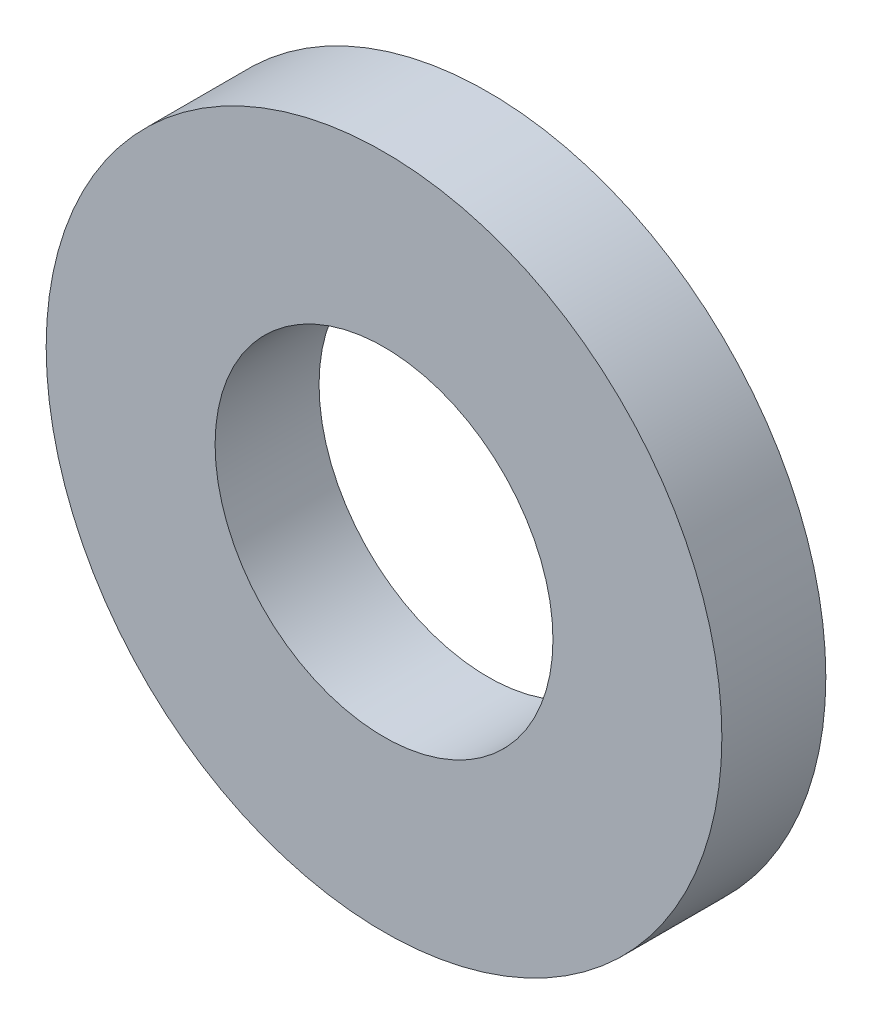
ISO-10303-21;
HEADER;
FILE_DESCRIPTION(('STEP AP214'),'2;1');
FILE_NAME('part.step','',(''),(''),'','','');
FILE_SCHEMA(('AUTOMOTIVE_DESIGN { 1 0 10303 214 1 1 1 1 }'));
ENDSEC;
DATA;
#1=APPLICATION_CONTEXT('core data for automotive mechanical design processes');
#2=APPLICATION_PROTOCOL_DEFINITION('international standard','automotive_design',2000,#1);
#3=PRODUCT_CONTEXT('',#1,'mechanical');
#4=PRODUCT('Part','Part','',(#3));
#5=PRODUCT_RELATED_PRODUCT_CATEGORY('part','',(#4));
#6=PRODUCT_DEFINITION_FORMATION('','',#4);
#7=PRODUCT_DEFINITION_CONTEXT('part definition',#1,'design');
#8=PRODUCT_DEFINITION('design','',#6,#7);
#9=PRODUCT_DEFINITION_SHAPE('','',#8);
#10=(LENGTH_UNIT() NAMED_UNIT(*) SI_UNIT(.MILLI.,.METRE.));
#11=(NAMED_UNIT(*) PLANE_ANGLE_UNIT() SI_UNIT($,.RADIAN.));
#12=(NAMED_UNIT(*) SI_UNIT($,.STERADIAN.) SOLID_ANGLE_UNIT());
#13=UNCERTAINTY_MEASURE_WITH_UNIT(LENGTH_MEASURE(1.E-05),#10,'distance_accuracy_value','');
#14=(GEOMETRIC_REPRESENTATION_CONTEXT(3) GLOBAL_UNCERTAINTY_ASSIGNED_CONTEXT((#13)) GLOBAL_UNIT_ASSIGNED_CONTEXT((#10,
#11,#12)) REPRESENTATION_CONTEXT('',''));
#15=CARTESIAN_POINT('',(0.,0.,0.));
#16=DIRECTION('',(0.,0.,1.));
#17=DIRECTION('',(1.,0.,0.));
#18=AXIS2_PLACEMENT_3D('',#15,#16,#17);
#19=CARTESIAN_POINT('',(0.,0.,10.));
#20=DIRECTION('',(0.,0.,1.));
#21=DIRECTION('',(1.,0.,0.));
#22=AXIS2_PLACEMENT_3D('',#19,#20,#21);
#23=PLANE('',#22);
#24=CARTESIAN_POINT('',(0.,0.,10.));
#25=DIRECTION('',(0.,0.,1.));
#26=DIRECTION('',(1.,0.,0.));
#27=AXIS2_PLACEMENT_3D('',#24,#25,#26);
#28=CIRCLE('',#27,32.5);
#29=CARTESIAN_POINT('',(32.5,0.,10.));
#30=VERTEX_POINT('',#29);
#31=EDGE_CURVE('E10',#30,#30,#28,.T.);
#32=ORIENTED_EDGE('',*,*,#31,.T.);
#33=EDGE_LOOP('',(#32));
#34=FACE_BOUND('',#33,.T.);
#35=CARTESIAN_POINT('',(0.,0.,10.));
#36=DIRECTION('',(0.,0.,1.));
#37=DIRECTION('',(1.,0.,0.));
#38=AXIS2_PLACEMENT_3D('',#35,#36,#37);
#39=CIRCLE('',#38,16.25);
#40=CARTESIAN_POINT('',(16.25,0.,10.));
#41=VERTEX_POINT('',#40);
#42=EDGE_CURVE('E41',#41,#41,#39,.T.);
#43=ORIENTED_EDGE('',*,*,#42,.F.);
#44=EDGE_LOOP('',(#43));
#45=FACE_BOUND('',#44,.T.);
#46=ADVANCED_FACE('F30',(#34,#45),#23,.T.);
#47=CARTESIAN_POINT('',(0.,0.,0.));
#48=DIRECTION('',(0.,0.,1.));
#49=DIRECTION('',(1.,0.,0.));
#50=AXIS2_PLACEMENT_3D('',#47,#48,#49);
#51=PLANE('',#50);
#52=CARTESIAN_POINT('',(0.,0.,0.));
#53=DIRECTION('',(0.,0.,1.));
#54=DIRECTION('',(1.,0.,0.));
#55=AXIS2_PLACEMENT_3D('',#52,#53,#54);
#56=CIRCLE('',#55,32.5);
#57=CARTESIAN_POINT('',(32.5,0.,0.));
#58=VERTEX_POINT('',#57);
#59=EDGE_CURVE('E34',#58,#58,#56,.T.);
#60=ORIENTED_EDGE('',*,*,#59,.F.);
#61=EDGE_LOOP('',(#60));
#62=FACE_BOUND('',#61,.T.);
#63=CARTESIAN_POINT('',(0.,0.,0.));
#64=DIRECTION('',(0.,0.,1.));
#65=DIRECTION('',(1.,0.,0.));
#66=AXIS2_PLACEMENT_3D('',#63,#64,#65);
#67=CIRCLE('',#66,16.25);
#68=CARTESIAN_POINT('',(16.25,0.,0.));
#69=VERTEX_POINT('',#68);
#70=EDGE_CURVE('E43',#69,#69,#67,.T.);
#71=ORIENTED_EDGE('',*,*,#70,.T.);
#72=EDGE_LOOP('',(#71));
#73=FACE_BOUND('',#72,.T.);
#74=ADVANCED_FACE('F53',(#62,#73),#51,.F.);
#75=CARTESIAN_POINT('',(0.,0.,10.));
#76=DIRECTION('',(0.,0.,-1.));
#77=DIRECTION('',(-1.,0.,0.));
#78=AXIS2_PLACEMENT_3D('',#75,#76,#77);
#79=CYLINDRICAL_SURFACE('',#78,32.5);
#80=ORIENTED_EDGE('',*,*,#31,.F.);
#81=EDGE_LOOP('',(#80));
#82=FACE_BOUND('',#81,.T.);
#83=ORIENTED_EDGE('',*,*,#59,.T.);
#84=EDGE_LOOP('',(#83));
#85=FACE_BOUND('',#84,.T.);
#86=ADVANCED_FACE('F32',(#82,#85),#79,.T.);
#87=CARTESIAN_POINT('',(0.,0.,10.));
#88=DIRECTION('',(0.,0.,-1.));
#89=DIRECTION('',(-1.,0.,0.));
#90=AXIS2_PLACEMENT_3D('',#87,#88,#89);
#91=CYLINDRICAL_SURFACE('',#90,16.25);
#92=ORIENTED_EDGE('',*,*,#42,.T.);
#93=EDGE_LOOP('',(#92));
#94=FACE_BOUND('',#93,.T.);
#95=ORIENTED_EDGE('',*,*,#70,.F.);
#96=EDGE_LOOP('',(#95));
#97=FACE_BOUND('',#96,.T.);
#98=ADVANCED_FACE('F49',(#94,#97),#91,.F.);
#99=CLOSED_SHELL('',(#46,#74,#86,#98));
#100=MANIFOLD_SOLID_BREP('B2',#99);
#101=ADVANCED_BREP_SHAPE_REPRESENTATION('',(#18,#100),#14);
#102=SHAPE_DEFINITION_REPRESENTATION(#9,#101);
ENDSEC;
END-ISO-10303-21;
